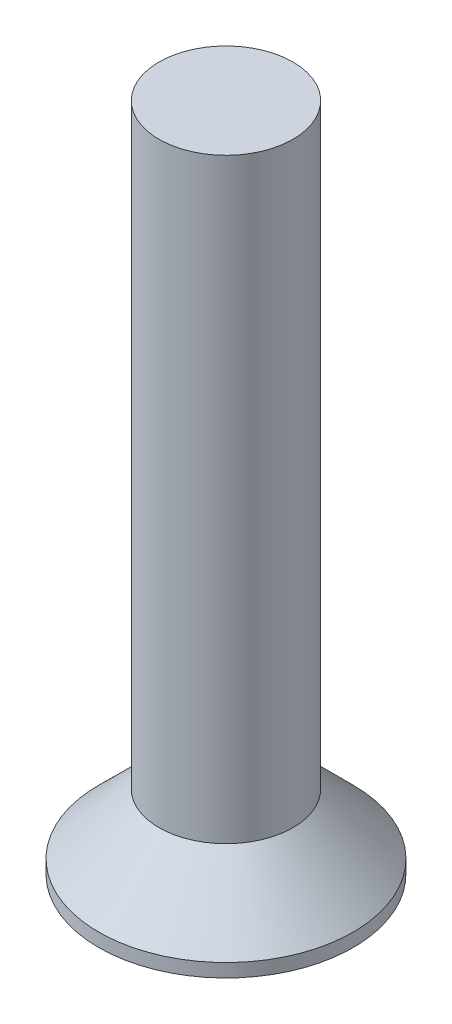
ISO-10303-21;
HEADER;
FILE_DESCRIPTION(('STEP AP214'),'2;1');
FILE_NAME('part.step','',(''),(''),'','','');
FILE_SCHEMA(('AUTOMOTIVE_DESIGN { 1 0 10303 214 1 1 1 1 }'));
ENDSEC;
DATA;
#1=APPLICATION_CONTEXT('core data for automotive mechanical design processes');
#2=APPLICATION_PROTOCOL_DEFINITION('international standard','automotive_design',2000,#1);
#3=PRODUCT_CONTEXT('',#1,'mechanical');
#4=PRODUCT('Part','Part','',(#3));
#5=PRODUCT_RELATED_PRODUCT_CATEGORY('part','',(#4));
#6=PRODUCT_DEFINITION_FORMATION('','',#4);
#7=PRODUCT_DEFINITION_CONTEXT('part definition',#1,'design');
#8=PRODUCT_DEFINITION('design','',#6,#7);
#9=PRODUCT_DEFINITION_SHAPE('','',#8);
#10=(LENGTH_UNIT() NAMED_UNIT(*) SI_UNIT(.MILLI.,.METRE.));
#11=(NAMED_UNIT(*) PLANE_ANGLE_UNIT() SI_UNIT($,.RADIAN.));
#12=(NAMED_UNIT(*) SI_UNIT($,.STERADIAN.) SOLID_ANGLE_UNIT());
#13=UNCERTAINTY_MEASURE_WITH_UNIT(LENGTH_MEASURE(1.E-05),#10,'distance_accuracy_value','');
#14=(GEOMETRIC_REPRESENTATION_CONTEXT(3) GLOBAL_UNCERTAINTY_ASSIGNED_CONTEXT((#13)) GLOBAL_UNIT_ASSIGNED_CONTEXT((#10,
#11,#12)) REPRESENTATION_CONTEXT('',''));
#15=CARTESIAN_POINT('',(0.,0.,0.));
#16=DIRECTION('',(0.,0.,1.));
#17=DIRECTION('',(1.,0.,0.));
#18=AXIS2_PLACEMENT_3D('',#15,#16,#17);
#19=CARTESIAN_POINT('',(0.,1.3,0.));
#20=DIRECTION('',(0.,-1.,0.));
#21=DIRECTION('',(0.,0.,-1.));
#22=AXIS2_PLACEMENT_3D('',#19,#20,#21);
#23=CYLINDRICAL_SURFACE('',#22,1.9);
#24=CARTESIAN_POINT('',(0.,0.199999999999992,0.));
#25=DIRECTION('',(0.,1.,0.));
#26=DIRECTION('',(0.,0.,1.));
#27=AXIS2_PLACEMENT_3D('',#24,#25,#26);
#28=CIRCLE('',#27,1.9);
#29=CARTESIAN_POINT('',(0.,0.199999999999992,-1.9));
#30=VERTEX_POINT('',#29);
#31=EDGE_CURVE('E45',#30,#30,#28,.F.);
#32=ORIENTED_EDGE('',*,*,#31,.T.);
#33=EDGE_LOOP('',(#32));
#34=FACE_BOUND('',#33,.T.);
#35=CARTESIAN_POINT('',(0.,0.,0.));
#36=DIRECTION('',(0.,1.,0.));
#37=DIRECTION('',(0.,0.,1.));
#38=AXIS2_PLACEMENT_3D('',#35,#36,#37);
#39=CIRCLE('',#38,1.9);
#40=CARTESIAN_POINT('',(0.,0.,1.9));
#41=VERTEX_POINT('',#40);
#42=EDGE_CURVE('E213',#41,#41,#39,.T.);
#43=ORIENTED_EDGE('',*,*,#42,.T.);
#44=EDGE_LOOP('',(#43));
#45=FACE_BOUND('',#44,.T.);
#46=ADVANCED_FACE('F36',(#34,#45),#23,.T.);
#47=CARTESIAN_POINT('',(0.,0.,0.));
#48=DIRECTION('',(0.,1.,0.));
#49=DIRECTION('',(0.,0.,1.));
#50=AXIS2_PLACEMENT_3D('',#47,#48,#49);
#51=PLANE('',#50);
#52=DIRECTION('',(1.,0.,0.));
#53=VECTOR('',#52,1.);
#54=CARTESIAN_POINT('',(-1.5,0.,-0.25));
#55=LINE('',#54,#53);
#56=CARTESIAN_POINT('',(-1.5,0.,-0.25));
#57=VERTEX_POINT('',#56);
#58=CARTESIAN_POINT('',(-0.25,0.,-0.25));
#59=VERTEX_POINT('',#58);
#60=EDGE_CURVE('E162',#57,#59,#55,.T.);
#61=ORIENTED_EDGE('',*,*,#60,.F.);
#62=DIRECTION('',(0.,0.,-1.));
#63=VECTOR('',#62,1.);
#64=CARTESIAN_POINT('',(-1.5,0.,0.25));
#65=LINE('',#64,#63);
#66=CARTESIAN_POINT('',(-1.5,0.,0.25));
#67=VERTEX_POINT('',#66);
#68=EDGE_CURVE('E52',#67,#57,#65,.T.);
#69=ORIENTED_EDGE('',*,*,#68,.F.);
#70=DIRECTION('',(-1.,0.,0.));
#71=VECTOR('',#70,1.);
#72=CARTESIAN_POINT('',(-0.25,0.,0.25));
#73=LINE('',#72,#71);
#74=CARTESIAN_POINT('',(-0.25,0.,0.25));
#75=VERTEX_POINT('',#74);
#76=EDGE_CURVE('E189',#75,#67,#73,.T.);
#77=ORIENTED_EDGE('',*,*,#76,.F.);
#78=DIRECTION('',(0.,0.,-1.));
#79=VECTOR('',#78,1.);
#80=CARTESIAN_POINT('',(-0.25,0.,1.5));
#81=LINE('',#80,#79);
#82=CARTESIAN_POINT('',(-0.25,0.,1.5));
#83=VERTEX_POINT('',#82);
#84=EDGE_CURVE('E187',#83,#75,#81,.T.);
#85=ORIENTED_EDGE('',*,*,#84,.F.);
#86=DIRECTION('',(-1.,0.,0.));
#87=VECTOR('',#86,1.);
#88=CARTESIAN_POINT('',(-0.25,0.,1.5));
#89=LINE('',#88,#87);
#90=CARTESIAN_POINT('',(0.25,0.,1.5));
#91=VERTEX_POINT('',#90);
#92=EDGE_CURVE('E136',#91,#83,#89,.T.);
#93=ORIENTED_EDGE('',*,*,#92,.F.);
#94=DIRECTION('',(0.,0.,1.));
#95=VECTOR('',#94,1.);
#96=CARTESIAN_POINT('',(0.25,0.,0.25));
#97=LINE('',#96,#95);
#98=CARTESIAN_POINT('',(0.25,0.,0.25));
#99=VERTEX_POINT('',#98);
#100=EDGE_CURVE('E183',#99,#91,#97,.T.);
#101=ORIENTED_EDGE('',*,*,#100,.F.);
#102=DIRECTION('',(-1.,0.,0.));
#103=VECTOR('',#102,1.);
#104=CARTESIAN_POINT('',(1.5,0.,0.25));
#105=LINE('',#104,#103);
#106=CARTESIAN_POINT('',(1.5,0.,0.25));
#107=VERTEX_POINT('',#106);
#108=EDGE_CURVE('E180',#107,#99,#105,.T.);
#109=ORIENTED_EDGE('',*,*,#108,.F.);
#110=DIRECTION('',(0.,0.,1.));
#111=VECTOR('',#110,1.);
#112=CARTESIAN_POINT('',(1.5,0.,-0.25));
#113=LINE('',#112,#111);
#114=CARTESIAN_POINT('',(1.5,0.,-0.25));
#115=VERTEX_POINT('',#114);
#116=EDGE_CURVE('E177',#115,#107,#113,.T.);
#117=ORIENTED_EDGE('',*,*,#116,.F.);
#118=DIRECTION('',(1.,0.,0.));
#119=VECTOR('',#118,1.);
#120=CARTESIAN_POINT('',(0.25,0.,-0.25));
#121=LINE('',#120,#119);
#122=CARTESIAN_POINT('',(0.25,0.,-0.25));
#123=VERTEX_POINT('',#122);
#124=EDGE_CURVE('E174',#123,#115,#121,.T.);
#125=ORIENTED_EDGE('',*,*,#124,.F.);
#126=DIRECTION('',(0.,0.,1.));
#127=VECTOR('',#126,1.);
#128=CARTESIAN_POINT('',(0.25,0.,-1.5));
#129=LINE('',#128,#127);
#130=CARTESIAN_POINT('',(0.25,0.,-1.5));
#131=VERTEX_POINT('',#130);
#132=EDGE_CURVE('E171',#131,#123,#129,.T.);
#133=ORIENTED_EDGE('',*,*,#132,.F.);
#134=DIRECTION('',(1.,0.,0.));
#135=VECTOR('',#134,1.);
#136=CARTESIAN_POINT('',(-0.25,0.,-1.5));
#137=LINE('',#136,#135);
#138=CARTESIAN_POINT('',(-0.25,0.,-1.5));
#139=VERTEX_POINT('',#138);
#140=EDGE_CURVE('E168',#139,#131,#137,.T.);
#141=ORIENTED_EDGE('',*,*,#140,.F.);
#142=DIRECTION('',(0.,0.,-1.));
#143=VECTOR('',#142,1.);
#144=CARTESIAN_POINT('',(-0.25,0.,-0.25));
#145=LINE('',#144,#143);
#146=EDGE_CURVE('E165',#59,#139,#145,.T.);
#147=ORIENTED_EDGE('',*,*,#146,.F.);
#148=EDGE_LOOP('',(#61,#69,#77,#85,#93,#101,#109,#117,#125,#133,#141,#147));
#149=FACE_BOUND('',#148,.T.);
#150=ORIENTED_EDGE('',*,*,#42,.F.);
#151=EDGE_LOOP('',(#150));
#152=FACE_BOUND('',#151,.T.);
#153=ADVANCED_FACE('F229',(#149,#152),#51,.F.);
#154=CARTESIAN_POINT('',(0.,10.,0.));
#155=DIRECTION('',(0.,-1.,0.));
#156=DIRECTION('',(0.,0.,-1.));
#157=AXIS2_PLACEMENT_3D('',#154,#155,#156);
#158=CYLINDRICAL_SURFACE('',#157,1.);
#159=CARTESIAN_POINT('',(0.,1.09999999999998,0.));
#160=DIRECTION('',(0.,-1.,0.));
#161=DIRECTION('',(0.,0.,-1.));
#162=AXIS2_PLACEMENT_3D('',#159,#160,#161);
#163=CIRCLE('',#162,1.);
#164=CARTESIAN_POINT('',(0.,1.09999999999998,-1.));
#165=VERTEX_POINT('',#164);
#166=EDGE_CURVE('E11',#165,#165,#163,.F.);
#167=ORIENTED_EDGE('',*,*,#166,.T.);
#168=EDGE_LOOP('',(#167));
#169=FACE_BOUND('',#168,.T.);
#170=CARTESIAN_POINT('',(0.,10.,0.));
#171=DIRECTION('',(0.,-1.,0.));
#172=DIRECTION('',(0.,0.,-1.));
#173=AXIS2_PLACEMENT_3D('',#170,#171,#172);
#174=CIRCLE('',#173,1.);
#175=CARTESIAN_POINT('',(0.,10.,-1.));
#176=VERTEX_POINT('',#175);
#177=EDGE_CURVE('E193',#176,#176,#174,.T.);
#178=ORIENTED_EDGE('',*,*,#177,.T.);
#179=EDGE_LOOP('',(#178));
#180=FACE_BOUND('',#179,.T.);
#181=ADVANCED_FACE('F226',(#169,#180),#158,.T.);
#182=CARTESIAN_POINT('',(0.,10.,0.));
#183=DIRECTION('',(0.,-1.,0.));
#184=DIRECTION('',(0.,0.,-1.));
#185=AXIS2_PLACEMENT_3D('',#182,#183,#184);
#186=PLANE('',#185);
#187=ORIENTED_EDGE('',*,*,#177,.F.);
#188=EDGE_LOOP('',(#187));
#189=FACE_BOUND('',#188,.T.);
#190=ADVANCED_FACE('F223',(#189),#186,.F.);
#191=CARTESIAN_POINT('',(0.,1.3,0.));
#192=DIRECTION('',(0.,-1.,0.));
#193=DIRECTION('',(0.,0.,-1.));
#194=AXIS2_PLACEMENT_3D('',#191,#192,#193);
#195=CONICAL_SURFACE('',#194,0.799999999999981,0.785398163397454);
#196=CARTESIAN_POINT('',(0.,0.199999999999992,-1.9));
#197=CARTESIAN_POINT('',(0.,0.209374999999992,-1.890625));
#198=CARTESIAN_POINT('',(0.,0.218749999999992,-1.88125));
#199=CARTESIAN_POINT('',(0.,0.237499999999991,-1.8625));
#200=CARTESIAN_POINT('',(0.,0.246874999999991,-1.853125));
#201=CARTESIAN_POINT('',(0.,0.265624999999991,-1.834375));
#202=CARTESIAN_POINT('',(0.,0.274999999999991,-1.825));
#203=CARTESIAN_POINT('',(0.,0.293749999999991,-1.80625));
#204=CARTESIAN_POINT('',(0.,0.303124999999991,-1.796875));
#205=CARTESIAN_POINT('',(0.,0.32187499999999,-1.778125));
#206=CARTESIAN_POINT('',(0.,0.33124999999999,-1.76875));
#207=CARTESIAN_POINT('',(0.,0.34999999999999,-1.75));
#208=CARTESIAN_POINT('',(0.,0.35937499999999,-1.740625));
#209=CARTESIAN_POINT('',(0.,0.37812499999999,-1.721875));
#210=CARTESIAN_POINT('',(0.,0.38749999999999,-1.7125));
#211=CARTESIAN_POINT('',(0.,0.40624999999999,-1.69375));
#212=CARTESIAN_POINT('',(0.,0.415624999999989,-1.684375));
#213=CARTESIAN_POINT('',(0.,0.434374999999989,-1.665625));
#214=CARTESIAN_POINT('',(0.,0.443749999999989,-1.65625));
#215=CARTESIAN_POINT('',(0.,0.462499999999989,-1.6375));
#216=CARTESIAN_POINT('',(0.,0.471874999999989,-1.628125));
#217=CARTESIAN_POINT('',(0.,0.490624999999989,-1.609375));
#218=CARTESIAN_POINT('',(0.,0.499999999999989,-1.6));
#219=CARTESIAN_POINT('',(0.,0.518749999999988,-1.58125));
#220=CARTESIAN_POINT('',(0.,0.528124999999988,-1.571875));
#221=CARTESIAN_POINT('',(0.,0.546874999999988,-1.553125));
#222=CARTESIAN_POINT('',(0.,0.556249999999988,-1.54375));
#223=CARTESIAN_POINT('',(0.,0.574999999999988,-1.525));
#224=CARTESIAN_POINT('',(0.,0.584374999999988,-1.515625));
#225=CARTESIAN_POINT('',(0.,0.603124999999988,-1.496875));
#226=CARTESIAN_POINT('',(0.,0.612499999999987,-1.4875));
#227=CARTESIAN_POINT('',(0.,0.631249999999987,-1.46875));
#228=CARTESIAN_POINT('',(0.,0.640624999999987,-1.459375));
#229=CARTESIAN_POINT('',(0.,0.659374999999987,-1.440625));
#230=CARTESIAN_POINT('',(0.,0.668749999999987,-1.43125));
#231=CARTESIAN_POINT('',(0.,0.687499999999987,-1.4125));
#232=CARTESIAN_POINT('',(0.,0.696874999999987,-1.403125));
#233=CARTESIAN_POINT('',(0.,0.715624999999987,-1.384375));
#234=CARTESIAN_POINT('',(0.,0.724999999999986,-1.375));
#235=CARTESIAN_POINT('',(0.,0.743749999999986,-1.35625));
#236=CARTESIAN_POINT('',(0.,0.753124999999986,-1.346875));
#237=CARTESIAN_POINT('',(0.,0.771874999999986,-1.328125));
#238=CARTESIAN_POINT('',(0.,0.781249999999986,-1.31875));
#239=CARTESIAN_POINT('',(0.,0.799999999999986,-1.3));
#240=CARTESIAN_POINT('',(0.,0.809374999999986,-1.290625));
#241=CARTESIAN_POINT('',(0.,0.828124999999985,-1.271875));
#242=CARTESIAN_POINT('',(0.,0.837499999999985,-1.2625));
#243=CARTESIAN_POINT('',(0.,0.856249999999985,-1.24375));
#244=CARTESIAN_POINT('',(0.,0.865624999999985,-1.234375));
#245=CARTESIAN_POINT('',(0.,0.884374999999985,-1.215625));
#246=CARTESIAN_POINT('',(0.,0.893749999999985,-1.20625));
#247=CARTESIAN_POINT('',(0.,0.912499999999985,-1.1875));
#248=CARTESIAN_POINT('',(0.,0.921874999999984,-1.178125));
#249=CARTESIAN_POINT('',(0.,0.940624999999984,-1.159375));
#250=CARTESIAN_POINT('',(0.,0.949999999999984,-1.15));
#251=CARTESIAN_POINT('',(0.,0.968749999999984,-1.13125));
#252=CARTESIAN_POINT('',(0.,0.978124999999984,-1.121875));
#253=CARTESIAN_POINT('',(0.,0.996874999999984,-1.103125));
#254=CARTESIAN_POINT('',(0.,1.00624999999998,-1.09375));
#255=CARTESIAN_POINT('',(0.,1.02499999999998,-1.075));
#256=CARTESIAN_POINT('',(0.,1.03437499999998,-1.065625));
#257=CARTESIAN_POINT('',(0.,1.05312499999998,-1.046875));
#258=CARTESIAN_POINT('',(0.,1.06249999999998,-1.0375));
#259=CARTESIAN_POINT('',(0.,1.08124999999998,-1.01875));
#260=CARTESIAN_POINT('',(0.,1.09062499999998,-1.009375));
#261=CARTESIAN_POINT('',(0.,1.09999999999998,-1.));
#262=B_SPLINE_CURVE_WITH_KNOTS('',3,(#196,#197,#198,#199,#200,#201,#202,#203,#204,#205,#206,
#207,#208,#209,#210,#211,#212,#213,#214,#215,#216,#217,#218,#219,#220,#221,#222,#223,#224,#225,
#226,#227,#228,#229,#230,#231,#232,#233,#234,#235,#236,#237,#238,#239,#240,#241,#242,#243,#244,
#245,#246,#247,#248,#249,#250,#251,#252,#253,#254,#255,#256,#257,#258,#259,#260,#261),
.UNSPECIFIED.,.F.,.F.,(4,2,2,2,2,2,2,2,2,2,2,2,2,2,2,2,2,2,2,2,2,2,2,2,2,2,2,2,2,2,2,2,4),(0.,
0.0397747564417431,0.0795495128834863,0.119324269325229,0.159099025766972,0.198873782208716,
0.238648538650459,0.278423295092202,0.318198051533945,0.357972807975688,0.397747564417431,
0.437522320859174,0.477297077300917,0.517071833742661,0.556846590184404,0.596621346626147,
0.63639610306789,0.676170859509633,0.715945615951376,0.755720372393119,0.795495128834862,
0.835269885276605,0.875044641718348,0.914819398160092,0.954594154601835,0.994368911043578,
1.03414366748532,1.07391842392706,1.11369318036881,1.15346793681055,1.19324269325229,
1.23301744969404,1.27279220613578),.UNSPECIFIED.);
#263=EDGE_CURVE('BSEAM39',#30,#165,#262,.T.);
#264=ORIENTED_EDGE('',*,*,#31,.F.);
#265=ORIENTED_EDGE('',*,*,#166,.F.);
#266=ORIENTED_EDGE('',*,*,#263,.T.);
#267=ORIENTED_EDGE('',*,*,#263,.F.);
#268=EDGE_LOOP('',(#264,#266,#265,#267));
#269=FACE_BOUND('',#268,.T.);
#270=ADVANCED_FACE('F39',(#269),#195,.T.);
#271=CARTESIAN_POINT('',(-1.5,0.3,0.25));
#272=DIRECTION('',(-1.,0.,0.));
#273=DIRECTION('',(0.,0.,1.));
#274=AXIS2_PLACEMENT_3D('',#271,#272,#273);
#275=PLANE('',#274);
#276=ORIENTED_EDGE('',*,*,#68,.T.);
#277=DIRECTION('',(0.,-1.,0.));
#278=VECTOR('',#277,1.);
#279=CARTESIAN_POINT('',(-1.5,0.3,-0.25));
#280=LINE('',#279,#278);
#281=CARTESIAN_POINT('',(-1.5,0.3,-0.25));
#282=VERTEX_POINT('',#281);
#283=EDGE_CURVE('E100',#282,#57,#280,.T.);
#284=ORIENTED_EDGE('',*,*,#283,.F.);
#285=DIRECTION('',(0.,0.,-1.));
#286=VECTOR('',#285,1.);
#287=CARTESIAN_POINT('',(-1.5,0.3,0.25));
#288=LINE('',#287,#286);
#289=CARTESIAN_POINT('',(-1.5,0.3,0.25));
#290=VERTEX_POINT('',#289);
#291=EDGE_CURVE('E191',#290,#282,#288,.T.);
#292=ORIENTED_EDGE('',*,*,#291,.F.);
#293=DIRECTION('',(0.,-1.,0.));
#294=VECTOR('',#293,1.);
#295=CARTESIAN_POINT('',(-1.5,0.3,0.25));
#296=LINE('',#295,#294);
#297=EDGE_CURVE('E60',#290,#67,#296,.T.);
#298=ORIENTED_EDGE('',*,*,#297,.T.);
#299=EDGE_LOOP('',(#276,#284,#292,#298));
#300=FACE_BOUND('',#299,.T.);
#301=ADVANCED_FACE('F222',(#300),#275,.F.);
#302=CARTESIAN_POINT('',(-0.25,0.3,0.25));
#303=DIRECTION('',(0.,0.,1.));
#304=DIRECTION('',(1.,0.,0.));
#305=AXIS2_PLACEMENT_3D('',#302,#303,#304);
#306=PLANE('',#305);
#307=ORIENTED_EDGE('',*,*,#76,.T.);
#308=ORIENTED_EDGE('',*,*,#297,.F.);
#309=DIRECTION('',(-1.,0.,0.));
#310=VECTOR('',#309,1.);
#311=CARTESIAN_POINT('',(-0.25,0.3,0.25));
#312=LINE('',#311,#310);
#313=CARTESIAN_POINT('',(-0.25,0.3,0.25));
#314=VERTEX_POINT('',#313);
#315=EDGE_CURVE('E148',#314,#290,#312,.T.);
#316=ORIENTED_EDGE('',*,*,#315,.F.);
#317=DIRECTION('',(0.,-1.,0.));
#318=VECTOR('',#317,1.);
#319=CARTESIAN_POINT('',(-0.25,0.3,0.25));
#320=LINE('',#319,#318);
#321=EDGE_CURVE('E140',#314,#75,#320,.T.);
#322=ORIENTED_EDGE('',*,*,#321,.T.);
#323=EDGE_LOOP('',(#307,#308,#316,#322));
#324=FACE_BOUND('',#323,.T.);
#325=ADVANCED_FACE('F282',(#324),#306,.F.);
#326=CARTESIAN_POINT('',(-0.25,0.3,1.5));
#327=DIRECTION('',(-1.,0.,0.));
#328=DIRECTION('',(0.,0.,1.));
#329=AXIS2_PLACEMENT_3D('',#326,#327,#328);
#330=PLANE('',#329);
#331=ORIENTED_EDGE('',*,*,#84,.T.);
#332=ORIENTED_EDGE('',*,*,#321,.F.);
#333=DIRECTION('',(0.,0.,-1.));
#334=VECTOR('',#333,1.);
#335=CARTESIAN_POINT('',(-0.25,0.3,1.5));
#336=LINE('',#335,#334);
#337=CARTESIAN_POINT('',(-0.25,0.3,1.5));
#338=VERTEX_POINT('',#337);
#339=EDGE_CURVE('E144',#338,#314,#336,.T.);
#340=ORIENTED_EDGE('',*,*,#339,.F.);
#341=DIRECTION('',(0.,-1.,0.));
#342=VECTOR('',#341,1.);
#343=CARTESIAN_POINT('',(-0.25,0.3,1.5));
#344=LINE('',#343,#342);
#345=EDGE_CURVE('E129',#338,#83,#344,.T.);
#346=ORIENTED_EDGE('',*,*,#345,.T.);
#347=EDGE_LOOP('',(#331,#332,#340,#346));
#348=FACE_BOUND('',#347,.T.);
#349=ADVANCED_FACE('F145',(#348),#330,.F.);
#350=CARTESIAN_POINT('',(-0.25,0.3,1.5));
#351=DIRECTION('',(0.,0.,1.));
#352=DIRECTION('',(1.,0.,0.));
#353=AXIS2_PLACEMENT_3D('',#350,#351,#352);
#354=PLANE('',#353);
#355=ORIENTED_EDGE('',*,*,#92,.T.);
#356=ORIENTED_EDGE('',*,*,#345,.F.);
#357=DIRECTION('',(-1.,0.,0.));
#358=VECTOR('',#357,1.);
#359=CARTESIAN_POINT('',(-0.25,0.3,1.5));
#360=LINE('',#359,#358);
#361=CARTESIAN_POINT('',(0.25,0.3,1.5));
#362=VERTEX_POINT('',#361);
#363=EDGE_CURVE('E133',#362,#338,#360,.T.);
#364=ORIENTED_EDGE('',*,*,#363,.F.);
#365=DIRECTION('',(0.,-1.,0.));
#366=VECTOR('',#365,1.);
#367=CARTESIAN_POINT('',(0.25,0.3,1.5));
#368=LINE('',#367,#366);
#369=EDGE_CURVE('E141',#362,#91,#368,.T.);
#370=ORIENTED_EDGE('',*,*,#369,.T.);
#371=EDGE_LOOP('',(#355,#356,#364,#370));
#372=FACE_BOUND('',#371,.T.);
#373=ADVANCED_FACE('F131',(#372),#354,.F.);
#374=CARTESIAN_POINT('',(0.25,0.3,0.25));
#375=DIRECTION('',(1.,0.,0.));
#376=DIRECTION('',(0.,0.,-1.));
#377=AXIS2_PLACEMENT_3D('',#374,#375,#376);
#378=PLANE('',#377);
#379=ORIENTED_EDGE('',*,*,#100,.T.);
#380=ORIENTED_EDGE('',*,*,#369,.F.);
#381=DIRECTION('',(0.,0.,1.));
#382=VECTOR('',#381,1.);
#383=CARTESIAN_POINT('',(0.25,0.3,0.25));
#384=LINE('',#383,#382);
#385=CARTESIAN_POINT('',(0.25,0.3,0.25));
#386=VERTEX_POINT('',#385);
#387=EDGE_CURVE('E154',#386,#362,#384,.T.);
#388=ORIENTED_EDGE('',*,*,#387,.F.);
#389=DIRECTION('',(0.,-1.,0.));
#390=VECTOR('',#389,1.);
#391=CARTESIAN_POINT('',(0.25,0.3,0.25));
#392=LINE('',#391,#390);
#393=EDGE_CURVE('E196',#386,#99,#392,.T.);
#394=ORIENTED_EDGE('',*,*,#393,.T.);
#395=EDGE_LOOP('',(#379,#380,#388,#394));
#396=FACE_BOUND('',#395,.T.);
#397=ADVANCED_FACE('F281',(#396),#378,.F.);
#398=CARTESIAN_POINT('',(1.5,0.3,0.25));
#399=DIRECTION('',(0.,0.,1.));
#400=DIRECTION('',(1.,0.,0.));
#401=AXIS2_PLACEMENT_3D('',#398,#399,#400);
#402=PLANE('',#401);
#403=ORIENTED_EDGE('',*,*,#108,.T.);
#404=ORIENTED_EDGE('',*,*,#393,.F.);
#405=DIRECTION('',(-1.,0.,0.));
#406=VECTOR('',#405,1.);
#407=CARTESIAN_POINT('',(1.5,0.3,0.25));
#408=LINE('',#407,#406);
#409=CARTESIAN_POINT('',(1.5,0.3,0.25));
#410=VERTEX_POINT('',#409);
#411=EDGE_CURVE('E156',#410,#386,#408,.T.);
#412=ORIENTED_EDGE('',*,*,#411,.F.);
#413=DIRECTION('',(0.,-1.,0.));
#414=VECTOR('',#413,1.);
#415=CARTESIAN_POINT('',(1.5,0.3,0.25));
#416=LINE('',#415,#414);
#417=EDGE_CURVE('E198',#410,#107,#416,.T.);
#418=ORIENTED_EDGE('',*,*,#417,.T.);
#419=EDGE_LOOP('',(#403,#404,#412,#418));
#420=FACE_BOUND('',#419,.T.);
#421=ADVANCED_FACE('F277',(#420),#402,.F.);
#422=CARTESIAN_POINT('',(1.5,0.3,-0.25));
#423=DIRECTION('',(1.,0.,0.));
#424=DIRECTION('',(0.,0.,-1.));
#425=AXIS2_PLACEMENT_3D('',#422,#423,#424);
#426=PLANE('',#425);
#427=ORIENTED_EDGE('',*,*,#116,.T.);
#428=ORIENTED_EDGE('',*,*,#417,.F.);
#429=DIRECTION('',(0.,0.,1.));
#430=VECTOR('',#429,1.);
#431=CARTESIAN_POINT('',(1.5,0.3,-0.25));
#432=LINE('',#431,#430);
#433=CARTESIAN_POINT('',(1.5,0.3,-0.25));
#434=VERTEX_POINT('',#433);
#435=EDGE_CURVE('E272',#434,#410,#432,.T.);
#436=ORIENTED_EDGE('',*,*,#435,.F.);
#437=DIRECTION('',(0.,-1.,0.));
#438=VECTOR('',#437,1.);
#439=CARTESIAN_POINT('',(1.5,0.3,-0.25));
#440=LINE('',#439,#438);
#441=EDGE_CURVE('E200',#434,#115,#440,.T.);
#442=ORIENTED_EDGE('',*,*,#441,.T.);
#443=EDGE_LOOP('',(#427,#428,#436,#442));
#444=FACE_BOUND('',#443,.T.);
#445=ADVANCED_FACE('F298',(#444),#426,.F.);
#446=CARTESIAN_POINT('',(0.25,0.3,-0.25));
#447=DIRECTION('',(0.,0.,-1.));
#448=DIRECTION('',(-1.,0.,0.));
#449=AXIS2_PLACEMENT_3D('',#446,#447,#448);
#450=PLANE('',#449);
#451=ORIENTED_EDGE('',*,*,#124,.T.);
#452=ORIENTED_EDGE('',*,*,#441,.F.);
#453=DIRECTION('',(1.,0.,0.));
#454=VECTOR('',#453,1.);
#455=CARTESIAN_POINT('',(0.25,0.3,-0.25));
#456=LINE('',#455,#454);
#457=CARTESIAN_POINT('',(0.25,0.3,-0.25));
#458=VERTEX_POINT('',#457);
#459=EDGE_CURVE('E269',#458,#434,#456,.T.);
#460=ORIENTED_EDGE('',*,*,#459,.F.);
#461=DIRECTION('',(0.,-1.,0.));
#462=VECTOR('',#461,1.);
#463=CARTESIAN_POINT('',(0.25,0.3,-0.25));
#464=LINE('',#463,#462);
#465=EDGE_CURVE('E202',#458,#123,#464,.T.);
#466=ORIENTED_EDGE('',*,*,#465,.T.);
#467=EDGE_LOOP('',(#451,#452,#460,#466));
#468=FACE_BOUND('',#467,.T.);
#469=ADVANCED_FACE('F301',(#468),#450,.F.);
#470=CARTESIAN_POINT('',(0.25,0.3,-1.5));
#471=DIRECTION('',(1.,0.,0.));
#472=DIRECTION('',(0.,0.,-1.));
#473=AXIS2_PLACEMENT_3D('',#470,#471,#472);
#474=PLANE('',#473);
#475=ORIENTED_EDGE('',*,*,#132,.T.);
#476=ORIENTED_EDGE('',*,*,#465,.F.);
#477=DIRECTION('',(0.,0.,1.));
#478=VECTOR('',#477,1.);
#479=CARTESIAN_POINT('',(0.25,0.3,-1.5));
#480=LINE('',#479,#478);
#481=CARTESIAN_POINT('',(0.25,0.3,-1.5));
#482=VERTEX_POINT('',#481);
#483=EDGE_CURVE('E266',#482,#458,#480,.T.);
#484=ORIENTED_EDGE('',*,*,#483,.F.);
#485=DIRECTION('',(0.,-1.,0.));
#486=VECTOR('',#485,1.);
#487=CARTESIAN_POINT('',(0.25,0.3,-1.5));
#488=LINE('',#487,#486);
#489=EDGE_CURVE('E204',#482,#131,#488,.T.);
#490=ORIENTED_EDGE('',*,*,#489,.T.);
#491=EDGE_LOOP('',(#475,#476,#484,#490));
#492=FACE_BOUND('',#491,.T.);
#493=ADVANCED_FACE('F305',(#492),#474,.F.);
#494=CARTESIAN_POINT('',(-0.25,0.3,-1.5));
#495=DIRECTION('',(0.,0.,-1.));
#496=DIRECTION('',(-1.,0.,0.));
#497=AXIS2_PLACEMENT_3D('',#494,#495,#496);
#498=PLANE('',#497);
#499=ORIENTED_EDGE('',*,*,#140,.T.);
#500=ORIENTED_EDGE('',*,*,#489,.F.);
#501=DIRECTION('',(1.,0.,0.));
#502=VECTOR('',#501,1.);
#503=CARTESIAN_POINT('',(-0.25,0.3,-1.5));
#504=LINE('',#503,#502);
#505=CARTESIAN_POINT('',(-0.25,0.3,-1.5));
#506=VERTEX_POINT('',#505);
#507=EDGE_CURVE('E263',#506,#482,#504,.T.);
#508=ORIENTED_EDGE('',*,*,#507,.F.);
#509=DIRECTION('',(0.,-1.,0.));
#510=VECTOR('',#509,1.);
#511=CARTESIAN_POINT('',(-0.25,0.3,-1.5));
#512=LINE('',#511,#510);
#513=EDGE_CURVE('E206',#506,#139,#512,.T.);
#514=ORIENTED_EDGE('',*,*,#513,.T.);
#515=EDGE_LOOP('',(#499,#500,#508,#514));
#516=FACE_BOUND('',#515,.T.);
#517=ADVANCED_FACE('F309',(#516),#498,.F.);
#518=CARTESIAN_POINT('',(-0.25,0.3,-0.25));
#519=DIRECTION('',(-1.,0.,0.));
#520=DIRECTION('',(0.,0.,1.));
#521=AXIS2_PLACEMENT_3D('',#518,#519,#520);
#522=PLANE('',#521);
#523=ORIENTED_EDGE('',*,*,#146,.T.);
#524=ORIENTED_EDGE('',*,*,#513,.F.);
#525=DIRECTION('',(0.,0.,-1.));
#526=VECTOR('',#525,1.);
#527=CARTESIAN_POINT('',(-0.25,0.3,-0.25));
#528=LINE('',#527,#526);
#529=CARTESIAN_POINT('',(-0.25,0.3,-0.25));
#530=VERTEX_POINT('',#529);
#531=EDGE_CURVE('E258',#530,#506,#528,.T.);
#532=ORIENTED_EDGE('',*,*,#531,.F.);
#533=DIRECTION('',(0.,-1.,0.));
#534=VECTOR('',#533,1.);
#535=CARTESIAN_POINT('',(-0.25,0.3,-0.25));
#536=LINE('',#535,#534);
#537=EDGE_CURVE('E208',#530,#59,#536,.T.);
#538=ORIENTED_EDGE('',*,*,#537,.T.);
#539=EDGE_LOOP('',(#523,#524,#532,#538));
#540=FACE_BOUND('',#539,.T.);
#541=ADVANCED_FACE('F313',(#540),#522,.F.);
#542=CARTESIAN_POINT('',(-1.5,0.3,-0.25));
#543=DIRECTION('',(0.,0.,-1.));
#544=DIRECTION('',(-1.,0.,0.));
#545=AXIS2_PLACEMENT_3D('',#542,#543,#544);
#546=PLANE('',#545);
#547=ORIENTED_EDGE('',*,*,#60,.T.);
#548=ORIENTED_EDGE('',*,*,#537,.F.);
#549=DIRECTION('',(1.,0.,0.));
#550=VECTOR('',#549,1.);
#551=CARTESIAN_POINT('',(-1.5,0.3,-0.25));
#552=LINE('',#551,#550);
#553=EDGE_CURVE('E256',#282,#530,#552,.T.);
#554=ORIENTED_EDGE('',*,*,#553,.F.);
#555=ORIENTED_EDGE('',*,*,#283,.T.);
#556=EDGE_LOOP('',(#547,#548,#554,#555));
#557=FACE_BOUND('',#556,.T.);
#558=ADVANCED_FACE('F253',(#557),#546,.F.);
#559=CARTESIAN_POINT('',(0.,0.3,0.));
#560=DIRECTION('',(0.,-1.,0.));
#561=DIRECTION('',(0.,0.,-1.));
#562=AXIS2_PLACEMENT_3D('',#559,#560,#561);
#563=PLANE('',#562);
#564=ORIENTED_EDGE('',*,*,#291,.T.);
#565=ORIENTED_EDGE('',*,*,#553,.T.);
#566=ORIENTED_EDGE('',*,*,#531,.T.);
#567=ORIENTED_EDGE('',*,*,#507,.T.);
#568=ORIENTED_EDGE('',*,*,#483,.T.);
#569=ORIENTED_EDGE('',*,*,#459,.T.);
#570=ORIENTED_EDGE('',*,*,#435,.T.);
#571=ORIENTED_EDGE('',*,*,#411,.T.);
#572=ORIENTED_EDGE('',*,*,#387,.T.);
#573=ORIENTED_EDGE('',*,*,#363,.T.);
#574=ORIENTED_EDGE('',*,*,#339,.T.);
#575=ORIENTED_EDGE('',*,*,#315,.T.);
#576=EDGE_LOOP('',(#564,#565,#566,#567,#568,#569,#570,#571,#572,#573,#574,#575));
#577=FACE_BOUND('',#576,.T.);
#578=ADVANCED_FACE('F151',(#577),#563,.T.);
#579=CLOSED_SHELL('',(#46,#153,#181,#190,#270,#301,#325,#349,#373,#397,#421,#445,#469,#493,#517,
#541,#558,#578));
#580=MANIFOLD_SOLID_BREP('B2',#579);
#581=ADVANCED_BREP_SHAPE_REPRESENTATION('',(#18,#580),#14);
#582=SHAPE_DEFINITION_REPRESENTATION(#9,#581);
ENDSEC;
END-ISO-10303-21;
